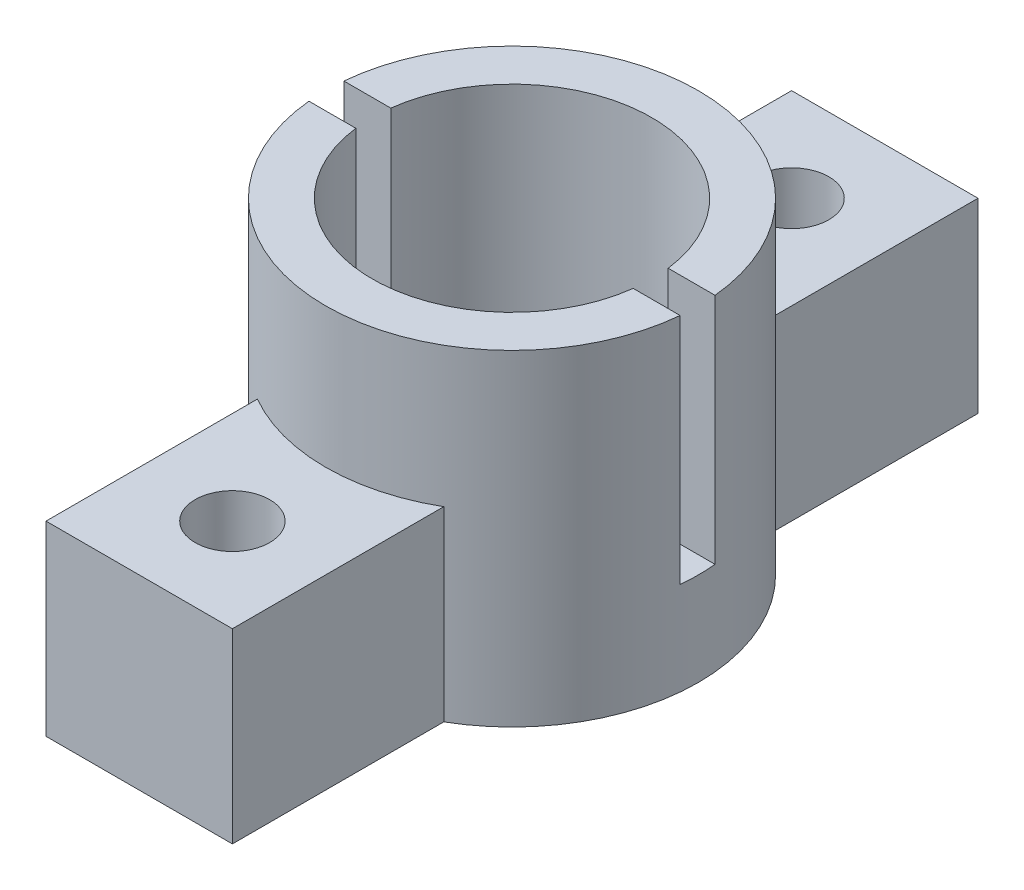
ISO-10303-21;
HEADER;
FILE_DESCRIPTION(('STEP AP214'),'2;1');
FILE_NAME('part.step','',(''),(''),'','','');
FILE_SCHEMA(('AUTOMOTIVE_DESIGN { 1 0 10303 214 1 1 1 1 }'));
ENDSEC;
DATA;
#1=APPLICATION_CONTEXT('core data for automotive mechanical design processes');
#2=APPLICATION_PROTOCOL_DEFINITION('international standard','automotive_design',2000,#1);
#3=PRODUCT_CONTEXT('',#1,'mechanical');
#4=PRODUCT('Part','Part','',(#3));
#5=PRODUCT_RELATED_PRODUCT_CATEGORY('part','',(#4));
#6=PRODUCT_DEFINITION_FORMATION('','',#4);
#7=PRODUCT_DEFINITION_CONTEXT('part definition',#1,'design');
#8=PRODUCT_DEFINITION('design','',#6,#7);
#9=PRODUCT_DEFINITION_SHAPE('','',#8);
#10=(LENGTH_UNIT() NAMED_UNIT(*) SI_UNIT(.MILLI.,.METRE.));
#11=(NAMED_UNIT(*) PLANE_ANGLE_UNIT() SI_UNIT($,.RADIAN.));
#12=(NAMED_UNIT(*) SI_UNIT($,.STERADIAN.) SOLID_ANGLE_UNIT());
#13=UNCERTAINTY_MEASURE_WITH_UNIT(LENGTH_MEASURE(1.E-05),#10,'distance_accuracy_value','');
#14=(GEOMETRIC_REPRESENTATION_CONTEXT(3) GLOBAL_UNCERTAINTY_ASSIGNED_CONTEXT((#13)) GLOBAL_UNIT_ASSIGNED_CONTEXT((#10,
#11,#12)) REPRESENTATION_CONTEXT('',''));
#15=CARTESIAN_POINT('',(0.,0.,0.));
#16=DIRECTION('',(0.,0.,1.));
#17=DIRECTION('',(1.,0.,0.));
#18=AXIS2_PLACEMENT_3D('',#15,#16,#17);
#19=CARTESIAN_POINT('',(0.,12.,0.));
#20=DIRECTION('',(0.,-1.,0.));
#21=DIRECTION('',(0.,0.,-1.));
#22=AXIS2_PLACEMENT_3D('',#19,#20,#21);
#23=CYLINDRICAL_SURFACE('',#22,8.);
#24=DIRECTION('',(0.,1.,0.));
#25=VECTOR('',#24,1.);
#26=CARTESIAN_POINT('',(-7.964766161037,4.,-0.749999999999999));
#27=LINE('',#26,#25);
#28=CARTESIAN_POINT('',(-7.964766161037,4.,-0.749999999999999));
#29=VERTEX_POINT('',#28);
#30=CARTESIAN_POINT('',(-7.964766161037,14.,-0.749999999999999));
#31=VERTEX_POINT('',#30);
#32=EDGE_CURVE('E272',#29,#31,#27,.T.);
#33=ORIENTED_EDGE('',*,*,#32,.T.);
#34=CARTESIAN_POINT('',(0.,14.,0.));
#35=DIRECTION('',(0.,1.,0.));
#36=DIRECTION('',(0.,0.,1.));
#37=AXIS2_PLACEMENT_3D('',#34,#35,#36);
#38=CIRCLE('',#37,8.);
#39=CARTESIAN_POINT('',(7.964766161037,14.,-0.75));
#40=VERTEX_POINT('',#39);
#41=EDGE_CURVE('E181',#31,#40,#38,.F.);
#42=ORIENTED_EDGE('',*,*,#41,.T.);
#43=DIRECTION('',(0.,1.,0.));
#44=VECTOR('',#43,1.);
#45=CARTESIAN_POINT('',(7.964766161037,4.,-0.75));
#46=LINE('',#45,#44);
#47=CARTESIAN_POINT('',(7.964766161037,4.,-0.75));
#48=VERTEX_POINT('',#47);
#49=EDGE_CURVE('E291',#48,#40,#46,.T.);
#50=ORIENTED_EDGE('',*,*,#49,.F.);
#51=CARTESIAN_POINT('',(0.,4.,0.));
#52=DIRECTION('',(0.,1.,0.));
#53=DIRECTION('',(0.,0.,1.));
#54=AXIS2_PLACEMENT_3D('',#51,#52,#53);
#55=CIRCLE('',#54,8.);
#56=CARTESIAN_POINT('',(7.964766161037,4.,0.75));
#57=VERTEX_POINT('',#56);
#58=EDGE_CURVE('E278',#57,#48,#55,.T.);
#59=ORIENTED_EDGE('',*,*,#58,.F.);
#60=DIRECTION('',(0.,1.,0.));
#61=VECTOR('',#60,1.);
#62=CARTESIAN_POINT('',(7.964766161037,4.,0.75));
#63=LINE('',#62,#61);
#64=CARTESIAN_POINT('',(7.964766161037,14.,0.75));
#65=VERTEX_POINT('',#64);
#66=EDGE_CURVE('E287',#57,#65,#63,.T.);
#67=ORIENTED_EDGE('',*,*,#66,.T.);
#68=CARTESIAN_POINT('',(0.,14.,0.));
#69=DIRECTION('',(0.,1.,0.));
#70=DIRECTION('',(0.,0.,1.));
#71=AXIS2_PLACEMENT_3D('',#68,#69,#70);
#72=CIRCLE('',#71,8.);
#73=CARTESIAN_POINT('',(-7.964766161037,14.,0.750000000000001));
#74=VERTEX_POINT('',#73);
#75=EDGE_CURVE('E171',#74,#65,#72,.T.);
#76=ORIENTED_EDGE('',*,*,#75,.F.);
#77=DIRECTION('',(0.,1.,0.));
#78=VECTOR('',#77,1.);
#79=CARTESIAN_POINT('',(-7.96476616103699,4.,0.750000000000001));
#80=LINE('',#79,#78);
#81=CARTESIAN_POINT('',(-7.96476616103699,4.,0.750000000000001));
#82=VERTEX_POINT('',#81);
#83=EDGE_CURVE('E162',#82,#74,#80,.T.);
#84=ORIENTED_EDGE('',*,*,#83,.F.);
#85=CARTESIAN_POINT('',(0.,4.,0.));
#86=DIRECTION('',(0.,1.,0.));
#87=DIRECTION('',(0.,0.,1.));
#88=AXIS2_PLACEMENT_3D('',#85,#86,#87);
#89=CIRCLE('',#88,8.);
#90=EDGE_CURVE('E263',#29,#82,#89,.T.);
#91=ORIENTED_EDGE('',*,*,#90,.F.);
#92=EDGE_LOOP('',(#33,#42,#50,#59,#67,#76,#84,#91));
#93=FACE_BOUND('',#92,.T.);
#94=DIRECTION('',(0.,-1.,0.));
#95=VECTOR('',#94,1.);
#96=CARTESIAN_POINT('',(4.,8.,6.92820323027551));
#97=LINE('',#96,#95);
#98=CARTESIAN_POINT('',(4.,8.,6.92820323027551));
#99=VERTEX_POINT('',#98);
#100=CARTESIAN_POINT('',(4.,0.,6.92820323027551));
#101=VERTEX_POINT('',#100);
#102=EDGE_CURVE('E221',#99,#101,#97,.T.);
#103=ORIENTED_EDGE('',*,*,#102,.T.);
#104=CARTESIAN_POINT('',(0.,0.,0.));
#105=DIRECTION('',(0.,1.,0.));
#106=DIRECTION('',(0.,0.,1.));
#107=AXIS2_PLACEMENT_3D('',#104,#105,#106);
#108=CIRCLE('',#107,8.);
#109=CARTESIAN_POINT('',(4.,0.,-6.92820323027551));
#110=VERTEX_POINT('',#109);
#111=EDGE_CURVE('E297',#101,#110,#108,.T.);
#112=ORIENTED_EDGE('',*,*,#111,.T.);
#113=DIRECTION('',(0.,-1.,0.));
#114=VECTOR('',#113,1.);
#115=CARTESIAN_POINT('',(4.,8.,-6.92820323027551));
#116=LINE('',#115,#114);
#117=CARTESIAN_POINT('',(4.,8.,-6.92820323027551));
#118=VERTEX_POINT('',#117);
#119=EDGE_CURVE('E241',#118,#110,#116,.T.);
#120=ORIENTED_EDGE('',*,*,#119,.F.);
#121=CARTESIAN_POINT('',(0.,8.,0.));
#122=DIRECTION('',(0.,-1.,0.));
#123=DIRECTION('',(0.,0.,-1.));
#124=AXIS2_PLACEMENT_3D('',#121,#122,#123);
#125=CIRCLE('',#124,8.);
#126=CARTESIAN_POINT('',(-4.,8.,-6.92820323027551));
#127=VERTEX_POINT('',#126);
#128=EDGE_CURVE('E232',#127,#118,#125,.T.);
#129=ORIENTED_EDGE('',*,*,#128,.F.);
#130=DIRECTION('',(0.,-1.,0.));
#131=VECTOR('',#130,1.);
#132=CARTESIAN_POINT('',(-4.,8.,-6.92820323027551));
#133=LINE('',#132,#131);
#134=CARTESIAN_POINT('',(-4.,0.,-6.92820323027551));
#135=VERTEX_POINT('',#134);
#136=EDGE_CURVE('E258',#127,#135,#133,.T.);
#137=ORIENTED_EDGE('',*,*,#136,.T.);
#138=CARTESIAN_POINT('',(-4.,0.,6.92820323027551));
#139=VERTEX_POINT('',#138);
#140=EDGE_CURVE('E47',#135,#139,#108,.T.);
#141=ORIENTED_EDGE('',*,*,#140,.T.);
#142=DIRECTION('',(0.,-1.,0.));
#143=VECTOR('',#142,1.);
#144=CARTESIAN_POINT('',(-4.,8.,6.92820323027551));
#145=LINE('',#144,#143);
#146=CARTESIAN_POINT('',(-4.,8.,6.92820323027551));
#147=VERTEX_POINT('',#146);
#148=EDGE_CURVE('E54',#147,#139,#145,.T.);
#149=ORIENTED_EDGE('',*,*,#148,.F.);
#150=CARTESIAN_POINT('',(0.,8.,0.));
#151=DIRECTION('',(0.,-1.,0.));
#152=DIRECTION('',(0.,0.,-1.));
#153=AXIS2_PLACEMENT_3D('',#150,#151,#152);
#154=CIRCLE('',#153,8.);
#155=EDGE_CURVE('E58',#99,#147,#154,.T.);
#156=ORIENTED_EDGE('',*,*,#155,.F.);
#157=EDGE_LOOP('',(#103,#112,#120,#129,#137,#141,#149,#156));
#158=FACE_BOUND('',#157,.T.);
#159=ADVANCED_FACE('F39',(#93,#158),#23,.T.);
#160=CARTESIAN_POINT('',(0.,12.,0.));
#161=DIRECTION('',(0.,-1.,0.));
#162=DIRECTION('',(0.,0.,-1.));
#163=AXIS2_PLACEMENT_3D('',#160,#161,#162);
#164=CYLINDRICAL_SURFACE('',#163,6.);
#165=CARTESIAN_POINT('',(0.,2.,0.));
#166=DIRECTION('',(0.,1.,0.));
#167=DIRECTION('',(0.,0.,1.));
#168=AXIS2_PLACEMENT_3D('',#165,#166,#167);
#169=CIRCLE('',#168,6.);
#170=CARTESIAN_POINT('',(0.,2.,6.));
#171=VERTEX_POINT('',#170);
#172=EDGE_CURVE('E11',#171,#171,#169,.T.);
#173=ORIENTED_EDGE('',*,*,#172,.F.);
#174=EDGE_LOOP('',(#173));
#175=FACE_BOUND('',#174,.T.);
#176=DIRECTION('',(0.,1.,0.));
#177=VECTOR('',#176,1.);
#178=CARTESIAN_POINT('',(5.95294044989533,4.,-0.75));
#179=LINE('',#178,#177);
#180=CARTESIAN_POINT('',(5.95294044989533,4.,-0.75));
#181=VERTEX_POINT('',#180);
#182=CARTESIAN_POINT('',(5.95294044989533,14.,-0.75));
#183=VERTEX_POINT('',#182);
#184=EDGE_CURVE('E289',#181,#183,#179,.T.);
#185=ORIENTED_EDGE('',*,*,#184,.T.);
#186=CARTESIAN_POINT('',(0.,14.,0.));
#187=DIRECTION('',(0.,1.,0.));
#188=DIRECTION('',(0.,0.,1.));
#189=AXIS2_PLACEMENT_3D('',#186,#187,#188);
#190=CIRCLE('',#189,6.);
#191=CARTESIAN_POINT('',(-5.95294044989533,14.,-0.749999999999999));
#192=VERTEX_POINT('',#191);
#193=EDGE_CURVE('E187',#192,#183,#190,.F.);
#194=ORIENTED_EDGE('',*,*,#193,.F.);
#195=DIRECTION('',(0.,1.,0.));
#196=VECTOR('',#195,1.);
#197=CARTESIAN_POINT('',(-5.95294044989533,4.,-0.749999999999999));
#198=LINE('',#197,#196);
#199=CARTESIAN_POINT('',(-5.95294044989533,4.,-0.749999999999999));
#200=VERTEX_POINT('',#199);
#201=EDGE_CURVE('E161',#200,#192,#198,.T.);
#202=ORIENTED_EDGE('',*,*,#201,.F.);
#203=CARTESIAN_POINT('',(0.,4.,0.));
#204=DIRECTION('',(0.,1.,0.));
#205=DIRECTION('',(0.,0.,1.));
#206=AXIS2_PLACEMENT_3D('',#203,#204,#205);
#207=CIRCLE('',#206,6.);
#208=CARTESIAN_POINT('',(-5.95294044989533,4.,0.750000000000001));
#209=VERTEX_POINT('',#208);
#210=EDGE_CURVE('E158',#209,#200,#207,.F.);
#211=ORIENTED_EDGE('',*,*,#210,.F.);
#212=DIRECTION('',(0.,1.,0.));
#213=VECTOR('',#212,1.);
#214=CARTESIAN_POINT('',(-5.95294044989533,4.,0.750000000000001));
#215=LINE('',#214,#213);
#216=CARTESIAN_POINT('',(-5.95294044989533,14.,0.750000000000001));
#217=VERTEX_POINT('',#216);
#218=EDGE_CURVE('E151',#209,#217,#215,.T.);
#219=ORIENTED_EDGE('',*,*,#218,.T.);
#220=CARTESIAN_POINT('',(0.,14.,0.));
#221=DIRECTION('',(0.,1.,0.));
#222=DIRECTION('',(0.,0.,1.));
#223=AXIS2_PLACEMENT_3D('',#220,#221,#222);
#224=CIRCLE('',#223,6.);
#225=CARTESIAN_POINT('',(5.95294044989533,14.,0.749999999999999));
#226=VERTEX_POINT('',#225);
#227=EDGE_CURVE('E155',#226,#217,#224,.F.);
#228=ORIENTED_EDGE('',*,*,#227,.F.);
#229=DIRECTION('',(0.,1.,0.));
#230=VECTOR('',#229,1.);
#231=CARTESIAN_POINT('',(5.95294044989533,4.,0.75));
#232=LINE('',#231,#230);
#233=CARTESIAN_POINT('',(5.95294044989533,4.,0.75));
#234=VERTEX_POINT('',#233);
#235=EDGE_CURVE('E267',#234,#226,#232,.T.);
#236=ORIENTED_EDGE('',*,*,#235,.F.);
#237=CARTESIAN_POINT('',(0.,4.,0.));
#238=DIRECTION('',(0.,1.,0.));
#239=DIRECTION('',(0.,0.,1.));
#240=AXIS2_PLACEMENT_3D('',#237,#238,#239);
#241=CIRCLE('',#240,6.);
#242=EDGE_CURVE('E284',#181,#234,#241,.F.);
#243=ORIENTED_EDGE('',*,*,#242,.F.);
#244=EDGE_LOOP('',(#185,#194,#202,#211,#219,#228,#236,#243));
#245=FACE_BOUND('',#244,.T.);
#246=ADVANCED_FACE('F41',(#175,#245),#164,.F.);
#247=CARTESIAN_POINT('',(0.,0.,0.));
#248=DIRECTION('',(0.,1.,0.));
#249=DIRECTION('',(0.,0.,1.));
#250=AXIS2_PLACEMENT_3D('',#247,#248,#249);
#251=PLANE('',#250);
#252=ORIENTED_EDGE('',*,*,#140,.F.);
#253=DIRECTION('',(0.,0.,1.));
#254=VECTOR('',#253,1.);
#255=CARTESIAN_POINT('',(-4.,0.,0.));
#256=LINE('',#255,#254);
#257=CARTESIAN_POINT('',(-4.,0.,-16.));
#258=VERTEX_POINT('',#257);
#259=EDGE_CURVE('E247',#258,#135,#256,.T.);
#260=ORIENTED_EDGE('',*,*,#259,.F.);
#261=DIRECTION('',(-1.,0.,0.));
#262=VECTOR('',#261,1.);
#263=CARTESIAN_POINT('',(0.,0.,-16.));
#264=LINE('',#263,#262);
#265=CARTESIAN_POINT('',(4.,0.,-16.));
#266=VERTEX_POINT('',#265);
#267=EDGE_CURVE('E229',#266,#258,#264,.T.);
#268=ORIENTED_EDGE('',*,*,#267,.F.);
#269=DIRECTION('',(0.,0.,1.));
#270=VECTOR('',#269,1.);
#271=CARTESIAN_POINT('',(4.,0.,0.));
#272=LINE('',#271,#270);
#273=EDGE_CURVE('E244',#266,#110,#272,.T.);
#274=ORIENTED_EDGE('',*,*,#273,.T.);
#275=ORIENTED_EDGE('',*,*,#111,.F.);
#276=DIRECTION('',(0.,0.,-1.));
#277=VECTOR('',#276,1.);
#278=CARTESIAN_POINT('',(4.,0.,0.));
#279=LINE('',#278,#277);
#280=CARTESIAN_POINT('',(4.,0.,16.));
#281=VERTEX_POINT('',#280);
#282=EDGE_CURVE('E198',#281,#101,#279,.T.);
#283=ORIENTED_EDGE('',*,*,#282,.F.);
#284=DIRECTION('',(-1.,0.,0.));
#285=VECTOR('',#284,1.);
#286=CARTESIAN_POINT('',(0.,0.,16.));
#287=LINE('',#286,#285);
#288=CARTESIAN_POINT('',(-4.,0.,16.));
#289=VERTEX_POINT('',#288);
#290=EDGE_CURVE('E210',#281,#289,#287,.T.);
#291=ORIENTED_EDGE('',*,*,#290,.T.);
#292=DIRECTION('',(0.,0.,-1.));
#293=VECTOR('',#292,1.);
#294=CARTESIAN_POINT('',(-4.,0.,0.));
#295=LINE('',#294,#293);
#296=EDGE_CURVE('E213',#289,#139,#295,.T.);
#297=ORIENTED_EDGE('',*,*,#296,.T.);
#298=EDGE_LOOP('',(#252,#260,#268,#274,#275,#283,#291,#297));
#299=FACE_BOUND('',#298,.T.);
#300=CARTESIAN_POINT('',(0.,0.,0.));
#301=DIRECTION('',(0.,1.,0.));
#302=DIRECTION('',(0.,0.,1.));
#303=AXIS2_PLACEMENT_3D('',#300,#301,#302);
#304=CIRCLE('',#303,2.);
#305=CARTESIAN_POINT('',(0.,0.,2.));
#306=VERTEX_POINT('',#305);
#307=EDGE_CURVE('E274',#306,#306,#304,.T.);
#308=ORIENTED_EDGE('',*,*,#307,.T.);
#309=EDGE_LOOP('',(#308));
#310=FACE_BOUND('',#309,.T.);
#311=CARTESIAN_POINT('',(0.,0.,-12.));
#312=DIRECTION('',(0.,-1.,0.));
#313=DIRECTION('',(0.,0.,-1.));
#314=AXIS2_PLACEMENT_3D('',#311,#312,#313);
#315=CIRCLE('',#314,1.6);
#316=CARTESIAN_POINT('',(0.,0.,-13.6));
#317=VERTEX_POINT('',#316);
#318=EDGE_CURVE('E220',#317,#317,#315,.T.);
#319=ORIENTED_EDGE('',*,*,#318,.F.);
#320=EDGE_LOOP('',(#319));
#321=FACE_BOUND('',#320,.T.);
#322=CARTESIAN_POINT('',(0.,0.,12.));
#323=DIRECTION('',(0.,-1.,0.));
#324=DIRECTION('',(0.,0.,-1.));
#325=AXIS2_PLACEMENT_3D('',#322,#323,#324);
#326=CIRCLE('',#325,1.6);
#327=CARTESIAN_POINT('',(0.,0.,10.4));
#328=VERTEX_POINT('',#327);
#329=EDGE_CURVE('E193',#328,#328,#326,.T.);
#330=ORIENTED_EDGE('',*,*,#329,.F.);
#331=EDGE_LOOP('',(#330));
#332=FACE_BOUND('',#331,.T.);
#333=ADVANCED_FACE('F307',(#299,#310,#321,#332),#251,.F.);
#334=CARTESIAN_POINT('',(0.,2.,0.));
#335=DIRECTION('',(0.,-1.,0.));
#336=DIRECTION('',(0.,0.,-1.));
#337=AXIS2_PLACEMENT_3D('',#334,#335,#336);
#338=CYLINDRICAL_SURFACE('',#337,2.);
#339=CARTESIAN_POINT('',(0.,2.,0.));
#340=DIRECTION('',(0.,1.,0.));
#341=DIRECTION('',(0.,0.,1.));
#342=AXIS2_PLACEMENT_3D('',#339,#340,#341);
#343=CIRCLE('',#342,2.);
#344=CARTESIAN_POINT('',(0.,2.,2.));
#345=VERTEX_POINT('',#344);
#346=EDGE_CURVE('E294',#345,#345,#343,.T.);
#347=ORIENTED_EDGE('',*,*,#346,.T.);
#348=EDGE_LOOP('',(#347));
#349=FACE_BOUND('',#348,.T.);
#350=ORIENTED_EDGE('',*,*,#307,.F.);
#351=EDGE_LOOP('',(#350));
#352=FACE_BOUND('',#351,.T.);
#353=ADVANCED_FACE('F338',(#349,#352),#338,.F.);
#354=CARTESIAN_POINT('',(0.,2.,0.));
#355=DIRECTION('',(0.,1.,0.));
#356=DIRECTION('',(0.,0.,1.));
#357=AXIS2_PLACEMENT_3D('',#354,#355,#356);
#358=PLANE('',#357);
#359=ORIENTED_EDGE('',*,*,#346,.F.);
#360=EDGE_LOOP('',(#359));
#361=FACE_BOUND('',#360,.T.);
#362=ORIENTED_EDGE('',*,*,#172,.T.);
#363=EDGE_LOOP('',(#362));
#364=FACE_BOUND('',#363,.T.);
#365=ADVANCED_FACE('F341',(#361,#364),#358,.T.);
#366=CARTESIAN_POINT('',(0.,4.,0.75));
#367=DIRECTION('',(0.,0.,-1.));
#368=DIRECTION('',(-1.,0.,0.));
#369=AXIS2_PLACEMENT_3D('',#366,#367,#368);
#370=PLANE('',#369);
#371=ORIENTED_EDGE('',*,*,#235,.T.);
#372=DIRECTION('',(-1.,0.,0.));
#373=VECTOR('',#372,1.);
#374=CARTESIAN_POINT('',(0.,14.,0.75));
#375=LINE('',#374,#373);
#376=EDGE_CURVE('E176',#65,#226,#375,.T.);
#377=ORIENTED_EDGE('',*,*,#376,.F.);
#378=ORIENTED_EDGE('',*,*,#66,.F.);
#379=DIRECTION('',(-1.,0.,0.));
#380=VECTOR('',#379,1.);
#381=CARTESIAN_POINT('',(0.,4.,0.75));
#382=LINE('',#381,#380);
#383=EDGE_CURVE('E254',#57,#234,#382,.T.);
#384=ORIENTED_EDGE('',*,*,#383,.T.);
#385=EDGE_LOOP('',(#371,#377,#378,#384));
#386=FACE_BOUND('',#385,.T.);
#387=ADVANCED_FACE('F345',(#386),#370,.T.);
#388=CARTESIAN_POINT('',(0.,4.,-0.75));
#389=DIRECTION('',(0.,0.,-1.));
#390=DIRECTION('',(-1.,0.,0.));
#391=AXIS2_PLACEMENT_3D('',#388,#389,#390);
#392=PLANE('',#391);
#393=ORIENTED_EDGE('',*,*,#49,.T.);
#394=DIRECTION('',(1.,0.,0.));
#395=VECTOR('',#394,1.);
#396=CARTESIAN_POINT('',(0.,14.,-0.75));
#397=LINE('',#396,#395);
#398=EDGE_CURVE('E190',#183,#40,#397,.T.);
#399=ORIENTED_EDGE('',*,*,#398,.F.);
#400=ORIENTED_EDGE('',*,*,#184,.F.);
#401=DIRECTION('',(-1.,0.,0.));
#402=VECTOR('',#401,1.);
#403=CARTESIAN_POINT('',(0.,4.,-0.75));
#404=LINE('',#403,#402);
#405=EDGE_CURVE('E281',#48,#181,#404,.T.);
#406=ORIENTED_EDGE('',*,*,#405,.F.);
#407=EDGE_LOOP('',(#393,#399,#400,#406));
#408=FACE_BOUND('',#407,.T.);
#409=ADVANCED_FACE('F349',(#408),#392,.F.);
#410=CARTESIAN_POINT('',(0.,4.,0.));
#411=DIRECTION('',(0.,1.,0.));
#412=DIRECTION('',(0.,0.,1.));
#413=AXIS2_PLACEMENT_3D('',#410,#411,#412);
#414=PLANE('',#413);
#415=ORIENTED_EDGE('',*,*,#383,.F.);
#416=ORIENTED_EDGE('',*,*,#58,.T.);
#417=ORIENTED_EDGE('',*,*,#405,.T.);
#418=ORIENTED_EDGE('',*,*,#242,.T.);
#419=EDGE_LOOP('',(#415,#416,#417,#418));
#420=FACE_BOUND('',#419,.T.);
#421=ADVANCED_FACE('F353',(#420),#414,.T.);
#422=CARTESIAN_POINT('',(0.,4.,-0.749999999999999));
#423=DIRECTION('',(0.,0.,1.));
#424=DIRECTION('',(1.,0.,0.));
#425=AXIS2_PLACEMENT_3D('',#422,#423,#424);
#426=PLANE('',#425);
#427=ORIENTED_EDGE('',*,*,#201,.T.);
#428=DIRECTION('',(-1.,0.,0.));
#429=VECTOR('',#428,1.);
#430=CARTESIAN_POINT('',(0.,14.,-0.749999999999999));
#431=LINE('',#430,#429);
#432=EDGE_CURVE('E184',#192,#31,#431,.T.);
#433=ORIENTED_EDGE('',*,*,#432,.T.);
#434=ORIENTED_EDGE('',*,*,#32,.F.);
#435=DIRECTION('',(1.,0.,0.));
#436=VECTOR('',#435,1.);
#437=CARTESIAN_POINT('',(0.,4.,-0.749999999999999));
#438=LINE('',#437,#436);
#439=EDGE_CURVE('E270',#29,#200,#438,.T.);
#440=ORIENTED_EDGE('',*,*,#439,.T.);
#441=EDGE_LOOP('',(#427,#433,#434,#440));
#442=FACE_BOUND('',#441,.T.);
#443=ADVANCED_FACE('F357',(#442),#426,.T.);
#444=CARTESIAN_POINT('',(0.,4.,0.750000000000001));
#445=DIRECTION('',(0.,0.,1.));
#446=DIRECTION('',(1.,0.,0.));
#447=AXIS2_PLACEMENT_3D('',#444,#445,#446);
#448=PLANE('',#447);
#449=ORIENTED_EDGE('',*,*,#83,.T.);
#450=DIRECTION('',(-1.,0.,0.));
#451=VECTOR('',#450,1.);
#452=CARTESIAN_POINT('',(0.,14.,0.750000000000001));
#453=LINE('',#452,#451);
#454=EDGE_CURVE('E165',#217,#74,#453,.T.);
#455=ORIENTED_EDGE('',*,*,#454,.F.);
#456=ORIENTED_EDGE('',*,*,#218,.F.);
#457=DIRECTION('',(1.,0.,0.));
#458=VECTOR('',#457,1.);
#459=CARTESIAN_POINT('',(0.,4.,0.750000000000001));
#460=LINE('',#459,#458);
#461=EDGE_CURVE('E266',#82,#209,#460,.T.);
#462=ORIENTED_EDGE('',*,*,#461,.F.);
#463=EDGE_LOOP('',(#449,#455,#456,#462));
#464=FACE_BOUND('',#463,.T.);
#465=ADVANCED_FACE('F166',(#464),#448,.F.);
#466=CARTESIAN_POINT('',(0.,4.,0.));
#467=DIRECTION('',(0.,1.,0.));
#468=DIRECTION('',(0.,0.,1.));
#469=AXIS2_PLACEMENT_3D('',#466,#467,#468);
#470=PLANE('',#469);
#471=ORIENTED_EDGE('',*,*,#90,.T.);
#472=ORIENTED_EDGE('',*,*,#461,.T.);
#473=ORIENTED_EDGE('',*,*,#210,.T.);
#474=ORIENTED_EDGE('',*,*,#439,.F.);
#475=EDGE_LOOP('',(#471,#472,#473,#474));
#476=FACE_BOUND('',#475,.T.);
#477=ADVANCED_FACE('F361',(#476),#470,.T.);
#478=CARTESIAN_POINT('',(4.,8.,0.));
#479=DIRECTION('',(1.,0.,0.));
#480=DIRECTION('',(0.,0.,-1.));
#481=AXIS2_PLACEMENT_3D('',#478,#479,#480);
#482=PLANE('',#481);
#483=ORIENTED_EDGE('',*,*,#273,.F.);
#484=DIRECTION('',(0.,-1.,0.));
#485=VECTOR('',#484,1.);
#486=CARTESIAN_POINT('',(4.,8.,-16.));
#487=LINE('',#486,#485);
#488=CARTESIAN_POINT('',(4.,8.,-16.));
#489=VERTEX_POINT('',#488);
#490=EDGE_CURVE('E252',#489,#266,#487,.T.);
#491=ORIENTED_EDGE('',*,*,#490,.F.);
#492=DIRECTION('',(0.,0.,1.));
#493=VECTOR('',#492,1.);
#494=CARTESIAN_POINT('',(4.,8.,0.));
#495=LINE('',#494,#493);
#496=EDGE_CURVE('E228',#489,#118,#495,.T.);
#497=ORIENTED_EDGE('',*,*,#496,.T.);
#498=ORIENTED_EDGE('',*,*,#119,.T.);
#499=EDGE_LOOP('',(#483,#491,#497,#498));
#500=FACE_BOUND('',#499,.T.);
#501=ADVANCED_FACE('F304',(#500),#482,.T.);
#502=CARTESIAN_POINT('',(0.,8.,-16.));
#503=DIRECTION('',(0.,0.,1.));
#504=DIRECTION('',(1.,0.,0.));
#505=AXIS2_PLACEMENT_3D('',#502,#503,#504);
#506=PLANE('',#505);
#507=ORIENTED_EDGE('',*,*,#267,.T.);
#508=DIRECTION('',(0.,-1.,0.));
#509=VECTOR('',#508,1.);
#510=CARTESIAN_POINT('',(-4.,8.,-16.));
#511=LINE('',#510,#509);
#512=CARTESIAN_POINT('',(-4.,8.,-16.));
#513=VERTEX_POINT('',#512);
#514=EDGE_CURVE('E255',#513,#258,#511,.T.);
#515=ORIENTED_EDGE('',*,*,#514,.F.);
#516=DIRECTION('',(-1.,0.,0.));
#517=VECTOR('',#516,1.);
#518=CARTESIAN_POINT('',(0.,8.,-16.));
#519=LINE('',#518,#517);
#520=EDGE_CURVE('E238',#489,#513,#519,.T.);
#521=ORIENTED_EDGE('',*,*,#520,.F.);
#522=ORIENTED_EDGE('',*,*,#490,.T.);
#523=EDGE_LOOP('',(#507,#515,#521,#522));
#524=FACE_BOUND('',#523,.T.);
#525=ADVANCED_FACE('F311',(#524),#506,.F.);
#526=CARTESIAN_POINT('',(-4.,8.,0.));
#527=DIRECTION('',(1.,0.,0.));
#528=DIRECTION('',(0.,0.,-1.));
#529=AXIS2_PLACEMENT_3D('',#526,#527,#528);
#530=PLANE('',#529);
#531=ORIENTED_EDGE('',*,*,#259,.T.);
#532=ORIENTED_EDGE('',*,*,#136,.F.);
#533=DIRECTION('',(0.,0.,1.));
#534=VECTOR('',#533,1.);
#535=CARTESIAN_POINT('',(-4.,8.,0.));
#536=LINE('',#535,#534);
#537=EDGE_CURVE('E235',#513,#127,#536,.T.);
#538=ORIENTED_EDGE('',*,*,#537,.F.);
#539=ORIENTED_EDGE('',*,*,#514,.T.);
#540=EDGE_LOOP('',(#531,#532,#538,#539));
#541=FACE_BOUND('',#540,.T.);
#542=ADVANCED_FACE('F317',(#541),#530,.F.);
#543=CARTESIAN_POINT('',(0.,8.,-12.));
#544=DIRECTION('',(0.,-1.,0.));
#545=DIRECTION('',(0.,0.,-1.));
#546=AXIS2_PLACEMENT_3D('',#543,#544,#545);
#547=CYLINDRICAL_SURFACE('',#546,1.6);
#548=CARTESIAN_POINT('',(0.,8.,-12.));
#549=DIRECTION('',(0.,-1.,0.));
#550=DIRECTION('',(0.,0.,-1.));
#551=AXIS2_PLACEMENT_3D('',#548,#549,#550);
#552=CIRCLE('',#551,1.6);
#553=CARTESIAN_POINT('',(0.,8.,-13.6));
#554=VERTEX_POINT('',#553);
#555=EDGE_CURVE('E225',#554,#554,#552,.T.);
#556=ORIENTED_EDGE('',*,*,#555,.F.);
#557=EDGE_LOOP('',(#556));
#558=FACE_BOUND('',#557,.T.);
#559=ORIENTED_EDGE('',*,*,#318,.T.);
#560=EDGE_LOOP('',(#559));
#561=FACE_BOUND('',#560,.T.);
#562=ADVANCED_FACE('F319',(#558,#561),#547,.F.);
#563=CARTESIAN_POINT('',(0.,8.,0.));
#564=DIRECTION('',(0.,-1.,0.));
#565=DIRECTION('',(0.,0.,-1.));
#566=AXIS2_PLACEMENT_3D('',#563,#564,#565);
#567=PLANE('',#566);
#568=ORIENTED_EDGE('',*,*,#555,.T.);
#569=EDGE_LOOP('',(#568));
#570=FACE_BOUND('',#569,.T.);
#571=ORIENTED_EDGE('',*,*,#496,.F.);
#572=ORIENTED_EDGE('',*,*,#520,.T.);
#573=ORIENTED_EDGE('',*,*,#537,.T.);
#574=ORIENTED_EDGE('',*,*,#128,.T.);
#575=EDGE_LOOP('',(#571,#572,#573,#574));
#576=FACE_BOUND('',#575,.T.);
#577=ADVANCED_FACE('F314',(#570,#576),#567,.F.);
#578=CARTESIAN_POINT('',(0.,8.,16.));
#579=DIRECTION('',(0.,0.,1.));
#580=DIRECTION('',(1.,0.,0.));
#581=AXIS2_PLACEMENT_3D('',#578,#579,#580);
#582=PLANE('',#581);
#583=ORIENTED_EDGE('',*,*,#290,.F.);
#584=DIRECTION('',(0.,-1.,0.));
#585=VECTOR('',#584,1.);
#586=CARTESIAN_POINT('',(4.,8.,16.));
#587=LINE('',#586,#585);
#588=CARTESIAN_POINT('',(4.,8.,16.));
#589=VERTEX_POINT('',#588);
#590=EDGE_CURVE('E218',#589,#281,#587,.T.);
#591=ORIENTED_EDGE('',*,*,#590,.F.);
#592=DIRECTION('',(-1.,0.,0.));
#593=VECTOR('',#592,1.);
#594=CARTESIAN_POINT('',(0.,8.,16.));
#595=LINE('',#594,#593);
#596=CARTESIAN_POINT('',(-4.,8.,16.));
#597=VERTEX_POINT('',#596);
#598=EDGE_CURVE('E197',#589,#597,#595,.T.);
#599=ORIENTED_EDGE('',*,*,#598,.T.);
#600=DIRECTION('',(0.,-1.,0.));
#601=VECTOR('',#600,1.);
#602=CARTESIAN_POINT('',(-4.,8.,16.));
#603=LINE('',#602,#601);
#604=EDGE_CURVE('E207',#597,#289,#603,.T.);
#605=ORIENTED_EDGE('',*,*,#604,.T.);
#606=EDGE_LOOP('',(#583,#591,#599,#605));
#607=FACE_BOUND('',#606,.T.);
#608=ADVANCED_FACE('F397',(#607),#582,.T.);
#609=CARTESIAN_POINT('',(4.,8.,0.));
#610=DIRECTION('',(-1.,0.,0.));
#611=DIRECTION('',(0.,0.,1.));
#612=AXIS2_PLACEMENT_3D('',#609,#610,#611);
#613=PLANE('',#612);
#614=ORIENTED_EDGE('',*,*,#282,.T.);
#615=ORIENTED_EDGE('',*,*,#102,.F.);
#616=DIRECTION('',(0.,0.,-1.));
#617=VECTOR('',#616,1.);
#618=CARTESIAN_POINT('',(4.,8.,0.));
#619=LINE('',#618,#617);
#620=EDGE_CURVE('E205',#589,#99,#619,.T.);
#621=ORIENTED_EDGE('',*,*,#620,.F.);
#622=ORIENTED_EDGE('',*,*,#590,.T.);
#623=EDGE_LOOP('',(#614,#615,#621,#622));
#624=FACE_BOUND('',#623,.T.);
#625=ADVANCED_FACE('F408',(#624),#613,.F.);
#626=CARTESIAN_POINT('',(0.,8.,12.));
#627=DIRECTION('',(0.,-1.,0.));
#628=DIRECTION('',(0.,0.,-1.));
#629=AXIS2_PLACEMENT_3D('',#626,#627,#628);
#630=CYLINDRICAL_SURFACE('',#629,1.6);
#631=CARTESIAN_POINT('',(0.,8.,12.));
#632=DIRECTION('',(0.,-1.,0.));
#633=DIRECTION('',(0.,0.,-1.));
#634=AXIS2_PLACEMENT_3D('',#631,#632,#633);
#635=CIRCLE('',#634,1.6);
#636=CARTESIAN_POINT('',(0.,8.,10.4));
#637=VERTEX_POINT('',#636);
#638=EDGE_CURVE('E194',#637,#637,#635,.T.);
#639=ORIENTED_EDGE('',*,*,#638,.F.);
#640=EDGE_LOOP('',(#639));
#641=FACE_BOUND('',#640,.T.);
#642=ORIENTED_EDGE('',*,*,#329,.T.);
#643=EDGE_LOOP('',(#642));
#644=FACE_BOUND('',#643,.T.);
#645=ADVANCED_FACE('F418',(#641,#644),#630,.F.);
#646=CARTESIAN_POINT('',(-4.,8.,0.));
#647=DIRECTION('',(-1.,0.,0.));
#648=DIRECTION('',(0.,0.,1.));
#649=AXIS2_PLACEMENT_3D('',#646,#647,#648);
#650=PLANE('',#649);
#651=ORIENTED_EDGE('',*,*,#296,.F.);
#652=ORIENTED_EDGE('',*,*,#604,.F.);
#653=DIRECTION('',(0.,0.,-1.));
#654=VECTOR('',#653,1.);
#655=CARTESIAN_POINT('',(-4.,8.,0.));
#656=LINE('',#655,#654);
#657=EDGE_CURVE('E201',#597,#147,#656,.T.);
#658=ORIENTED_EDGE('',*,*,#657,.T.);
#659=ORIENTED_EDGE('',*,*,#148,.T.);
#660=EDGE_LOOP('',(#651,#652,#658,#659));
#661=FACE_BOUND('',#660,.T.);
#662=ADVANCED_FACE('F428',(#661),#650,.T.);
#663=CARTESIAN_POINT('',(0.,8.,0.));
#664=DIRECTION('',(0.,-1.,0.));
#665=DIRECTION('',(0.,0.,-1.));
#666=AXIS2_PLACEMENT_3D('',#663,#664,#665);
#667=PLANE('',#666);
#668=ORIENTED_EDGE('',*,*,#638,.T.);
#669=EDGE_LOOP('',(#668));
#670=FACE_BOUND('',#669,.T.);
#671=ORIENTED_EDGE('',*,*,#598,.F.);
#672=ORIENTED_EDGE('',*,*,#620,.T.);
#673=ORIENTED_EDGE('',*,*,#155,.T.);
#674=ORIENTED_EDGE('',*,*,#657,.F.);
#675=EDGE_LOOP('',(#671,#672,#673,#674));
#676=FACE_BOUND('',#675,.T.);
#677=ADVANCED_FACE('F438',(#670,#676),#667,.F.);
#678=CARTESIAN_POINT('',(0.,14.,0.));
#679=DIRECTION('',(0.,1.,0.));
#680=DIRECTION('',(0.,0.,1.));
#681=AXIS2_PLACEMENT_3D('',#678,#679,#680);
#682=PLANE('',#681);
#683=ORIENTED_EDGE('',*,*,#41,.F.);
#684=ORIENTED_EDGE('',*,*,#432,.F.);
#685=ORIENTED_EDGE('',*,*,#193,.T.);
#686=ORIENTED_EDGE('',*,*,#398,.T.);
#687=EDGE_LOOP('',(#683,#684,#685,#686));
#688=FACE_BOUND('',#687,.T.);
#689=ADVANCED_FACE('F447',(#688),#682,.T.);
#690=CARTESIAN_POINT('',(0.,14.,0.));
#691=DIRECTION('',(0.,1.,0.));
#692=DIRECTION('',(0.,0.,1.));
#693=AXIS2_PLACEMENT_3D('',#690,#691,#692);
#694=PLANE('',#693);
#695=ORIENTED_EDGE('',*,*,#227,.T.);
#696=ORIENTED_EDGE('',*,*,#454,.T.);
#697=ORIENTED_EDGE('',*,*,#75,.T.);
#698=ORIENTED_EDGE('',*,*,#376,.T.);
#699=EDGE_LOOP('',(#695,#696,#697,#698));
#700=FACE_BOUND('',#699,.T.);
#701=ADVANCED_FACE('F174',(#700),#694,.T.);
#702=CLOSED_SHELL('',(#159,#246,#333,#353,#365,#387,#409,#421,#443,#465,#477,#501,#525,#542,
#562,#577,#608,#625,#645,#662,#677,#689,#701));
#703=MANIFOLD_SOLID_BREP('B2',#702);
#704=ADVANCED_BREP_SHAPE_REPRESENTATION('',(#18,#703),#14);
#705=SHAPE_DEFINITION_REPRESENTATION(#9,#704);
ENDSEC;
END-ISO-10303-21;
